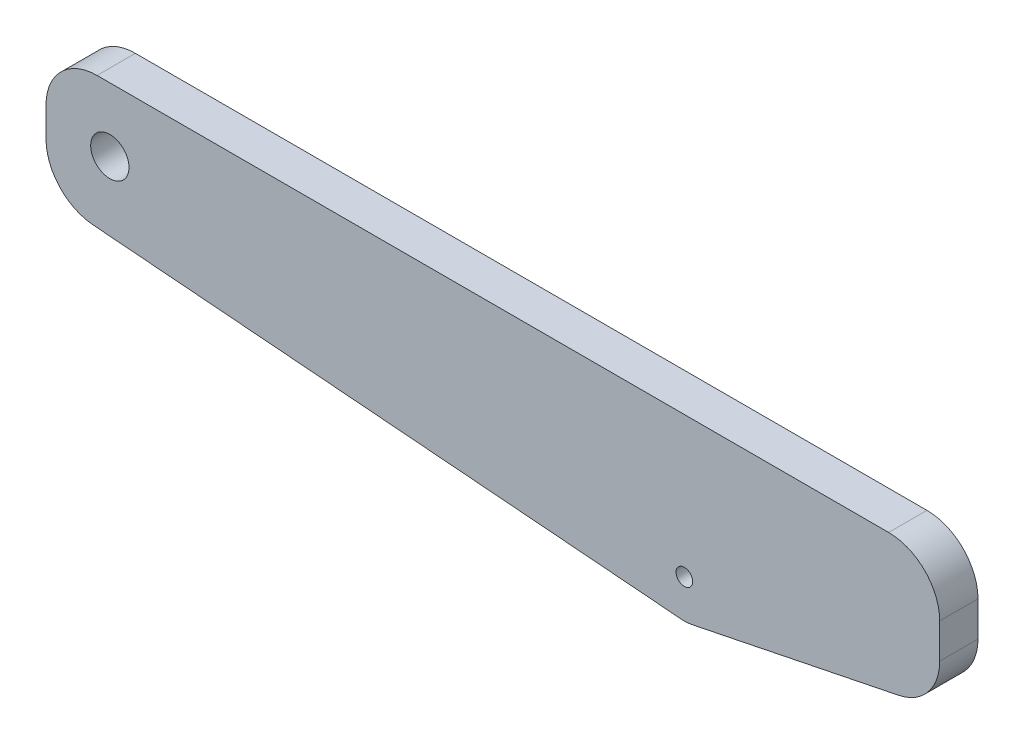
ISO-10303-21;
HEADER;
FILE_DESCRIPTION(('STEP AP214'),'2;1');
FILE_NAME('part.step','',(''),(''),'','','');
FILE_SCHEMA(('AUTOMOTIVE_DESIGN { 1 0 10303 214 1 1 1 1 }'));
ENDSEC;
DATA;
#1=APPLICATION_CONTEXT('core data for automotive mechanical design processes');
#2=APPLICATION_PROTOCOL_DEFINITION('international standard','automotive_design',2000,#1);
#3=PRODUCT_CONTEXT('',#1,'mechanical');
#4=PRODUCT('Part','Part','',(#3));
#5=PRODUCT_RELATED_PRODUCT_CATEGORY('part','',(#4));
#6=PRODUCT_DEFINITION_FORMATION('','',#4);
#7=PRODUCT_DEFINITION_CONTEXT('part definition',#1,'design');
#8=PRODUCT_DEFINITION('design','',#6,#7);
#9=PRODUCT_DEFINITION_SHAPE('','',#8);
#10=(LENGTH_UNIT() NAMED_UNIT(*) SI_UNIT(.MILLI.,.METRE.));
#11=(NAMED_UNIT(*) PLANE_ANGLE_UNIT() SI_UNIT($,.RADIAN.));
#12=(NAMED_UNIT(*) SI_UNIT($,.STERADIAN.) SOLID_ANGLE_UNIT());
#13=UNCERTAINTY_MEASURE_WITH_UNIT(LENGTH_MEASURE(1.E-05),#10,'distance_accuracy_value','');
#14=(GEOMETRIC_REPRESENTATION_CONTEXT(3) GLOBAL_UNCERTAINTY_ASSIGNED_CONTEXT((#13)) GLOBAL_UNIT_ASSIGNED_CONTEXT((#10,
#11,#12)) REPRESENTATION_CONTEXT('',''));
#15=CARTESIAN_POINT('',(0.,0.,0.));
#16=DIRECTION('',(0.,0.,1.));
#17=DIRECTION('',(1.,0.,0.));
#18=AXIS2_PLACEMENT_3D('',#15,#16,#17);
#19=CARTESIAN_POINT('',(330.,16.3352715419924,15.));
#20=DIRECTION('',(0.,0.,-1.));
#21=DIRECTION('',(-1.,0.,0.));
#22=AXIS2_PLACEMENT_3D('',#19,#20,#21);
#23=CYLINDRICAL_SURFACE('',#22,20.);
#24=DIRECTION('',(0.,0.,-1.));
#25=VECTOR('',#24,1.);
#26=CARTESIAN_POINT('',(350.,16.3352715419924,15.));
#27=LINE('',#26,#25);
#28=CARTESIAN_POINT('',(350.,16.3352715419924,15.));
#29=VERTEX_POINT('',#28);
#30=CARTESIAN_POINT('',(350.,16.3352715419924,0.));
#31=VERTEX_POINT('',#30);
#32=EDGE_CURVE('E169',#29,#31,#27,.T.);
#33=ORIENTED_EDGE('',*,*,#32,.F.);
#34=CARTESIAN_POINT('',(330.,16.3352715419924,15.));
#35=DIRECTION('',(0.,0.,1.));
#36=DIRECTION('',(1.,0.,0.));
#37=AXIS2_PLACEMENT_3D('',#34,#35,#36);
#38=CIRCLE('',#37,20.);
#39=CARTESIAN_POINT('',(333.993766222083,-3.26191783208227,15.));
#40=VERTEX_POINT('',#39);
#41=EDGE_CURVE('E40',#40,#29,#38,.T.);
#42=ORIENTED_EDGE('',*,*,#41,.F.);
#43=DIRECTION('',(0.,0.,-1.));
#44=VECTOR('',#43,1.);
#45=CARTESIAN_POINT('',(333.993766222083,-3.26191783208228,15.));
#46=LINE('',#45,#44);
#47=CARTESIAN_POINT('',(333.993766222083,-3.26191783208227,0.));
#48=VERTEX_POINT('',#47);
#49=EDGE_CURVE('E172',#48,#40,#46,.F.);
#50=ORIENTED_EDGE('',*,*,#49,.F.);
#51=CARTESIAN_POINT('',(330.,16.3352715419924,0.));
#52=DIRECTION('',(0.,0.,1.));
#53=DIRECTION('',(1.,0.,0.));
#54=AXIS2_PLACEMENT_3D('',#51,#52,#53);
#55=CIRCLE('',#54,20.);
#56=EDGE_CURVE('E11',#31,#48,#55,.F.);
#57=ORIENTED_EDGE('',*,*,#56,.F.);
#58=EDGE_LOOP('',(#33,#42,#50,#57));
#59=FACE_BOUND('',#58,.T.);
#60=ADVANCED_FACE('F33',(#59),#23,.T.);
#61=CARTESIAN_POINT('',(330.,30.,15.));
#62=DIRECTION('',(0.,0.,-1.));
#63=DIRECTION('',(-1.,0.,0.));
#64=AXIS2_PLACEMENT_3D('',#61,#62,#63);
#65=CYLINDRICAL_SURFACE('',#64,20.);
#66=DIRECTION('',(0.,0.,-1.));
#67=VECTOR('',#66,1.);
#68=CARTESIAN_POINT('',(330.,50.,15.));
#69=LINE('',#68,#67);
#70=CARTESIAN_POINT('',(330.,50.,15.));
#71=VERTEX_POINT('',#70);
#72=CARTESIAN_POINT('',(330.,50.,0.));
#73=VERTEX_POINT('',#72);
#74=EDGE_CURVE('E158',#71,#73,#69,.T.);
#75=ORIENTED_EDGE('',*,*,#74,.F.);
#76=CARTESIAN_POINT('',(330.,30.,15.));
#77=DIRECTION('',(0.,0.,1.));
#78=DIRECTION('',(1.,0.,0.));
#79=AXIS2_PLACEMENT_3D('',#76,#77,#78);
#80=CIRCLE('',#79,20.);
#81=CARTESIAN_POINT('',(350.,30.,15.));
#82=VERTEX_POINT('',#81);
#83=EDGE_CURVE('E164',#82,#71,#80,.T.);
#84=ORIENTED_EDGE('',*,*,#83,.F.);
#85=DIRECTION('',(0.,0.,-1.));
#86=VECTOR('',#85,1.);
#87=CARTESIAN_POINT('',(350.,30.,15.));
#88=LINE('',#87,#86);
#89=CARTESIAN_POINT('',(350.,30.,0.));
#90=VERTEX_POINT('',#89);
#91=EDGE_CURVE('E161',#90,#82,#88,.F.);
#92=ORIENTED_EDGE('',*,*,#91,.F.);
#93=CARTESIAN_POINT('',(330.,30.,0.));
#94=DIRECTION('',(0.,0.,1.));
#95=DIRECTION('',(1.,0.,0.));
#96=AXIS2_PLACEMENT_3D('',#93,#94,#95);
#97=CIRCLE('',#96,20.);
#98=EDGE_CURVE('E166',#73,#90,#97,.F.);
#99=ORIENTED_EDGE('',*,*,#98,.F.);
#100=EDGE_LOOP('',(#75,#84,#92,#99));
#101=FACE_BOUND('',#100,.T.);
#102=ADVANCED_FACE('F210',(#101),#65,.T.);
#103=CARTESIAN_POINT('',(20.,18.4551082880864,15.));
#104=DIRECTION('',(0.,0.,1.));
#105=DIRECTION('',(1.,0.,0.));
#106=AXIS2_PLACEMENT_3D('',#103,#104,#105);
#107=CYLINDRICAL_SURFACE('',#106,20.);
#108=DIRECTION('',(0.,0.,1.));
#109=VECTOR('',#108,1.);
#110=CARTESIAN_POINT('',(0.,18.4551082880864,15.));
#111=LINE('',#110,#109);
#112=CARTESIAN_POINT('',(0.,18.4551082880864,0.));
#113=VERTEX_POINT('',#112);
#114=CARTESIAN_POINT('',(0.,18.4551082880864,15.));
#115=VERTEX_POINT('',#114);
#116=EDGE_CURVE('E150',#113,#115,#111,.T.);
#117=ORIENTED_EDGE('',*,*,#116,.F.);
#118=CARTESIAN_POINT('',(20.,18.4551082880864,0.));
#119=DIRECTION('',(0.,0.,1.));
#120=DIRECTION('',(1.,0.,0.));
#121=AXIS2_PLACEMENT_3D('',#118,#119,#120);
#122=CIRCLE('',#121,20.);
#123=CARTESIAN_POINT('',(18.3956333167371,-1.48043804367077,0.));
#124=VERTEX_POINT('',#123);
#125=EDGE_CURVE('E155',#124,#113,#122,.F.);
#126=ORIENTED_EDGE('',*,*,#125,.F.);
#127=DIRECTION('',(0.,0.,1.));
#128=VECTOR('',#127,1.);
#129=CARTESIAN_POINT('',(18.3956333167371,-1.48043804367077,15.));
#130=LINE('',#129,#128);
#131=CARTESIAN_POINT('',(18.3956333167371,-1.48043804367077,15.));
#132=VERTEX_POINT('',#131);
#133=EDGE_CURVE('E153',#132,#124,#130,.F.);
#134=ORIENTED_EDGE('',*,*,#133,.F.);
#135=CARTESIAN_POINT('',(20.,18.4551082880864,15.));
#136=DIRECTION('',(0.,0.,1.));
#137=DIRECTION('',(1.,0.,0.));
#138=AXIS2_PLACEMENT_3D('',#135,#136,#137);
#139=CIRCLE('',#138,20.);
#140=EDGE_CURVE('E114',#115,#132,#139,.T.);
#141=ORIENTED_EDGE('',*,*,#140,.F.);
#142=EDGE_LOOP('',(#117,#126,#134,#141));
#143=FACE_BOUND('',#142,.T.);
#144=ADVANCED_FACE('F207',(#143),#107,.T.);
#145=CARTESIAN_POINT('',(20.,30.,15.));
#146=DIRECTION('',(0.,0.,1.));
#147=DIRECTION('',(1.,0.,0.));
#148=AXIS2_PLACEMENT_3D('',#145,#146,#147);
#149=CYLINDRICAL_SURFACE('',#148,20.);
#150=DIRECTION('',(0.,0.,1.));
#151=VECTOR('',#150,1.);
#152=CARTESIAN_POINT('',(20.,50.,15.));
#153=LINE('',#152,#151);
#154=CARTESIAN_POINT('',(20.,50.,0.));
#155=VERTEX_POINT('',#154);
#156=CARTESIAN_POINT('',(20.,50.,15.));
#157=VERTEX_POINT('',#156);
#158=EDGE_CURVE('E134',#155,#157,#153,.T.);
#159=ORIENTED_EDGE('',*,*,#158,.F.);
#160=CARTESIAN_POINT('',(20.,30.,0.));
#161=DIRECTION('',(0.,0.,1.));
#162=DIRECTION('',(1.,0.,0.));
#163=AXIS2_PLACEMENT_3D('',#160,#161,#162);
#164=CIRCLE('',#163,20.);
#165=CARTESIAN_POINT('',(0.,30.,0.));
#166=VERTEX_POINT('',#165);
#167=EDGE_CURVE('E145',#166,#155,#164,.F.);
#168=ORIENTED_EDGE('',*,*,#167,.F.);
#169=DIRECTION('',(0.,0.,1.));
#170=VECTOR('',#169,1.);
#171=CARTESIAN_POINT('',(0.,30.,15.));
#172=LINE('',#171,#170);
#173=CARTESIAN_POINT('',(0.,30.,15.));
#174=VERTEX_POINT('',#173);
#175=EDGE_CURVE('E137',#174,#166,#172,.F.);
#176=ORIENTED_EDGE('',*,*,#175,.F.);
#177=CARTESIAN_POINT('',(20.,30.,15.));
#178=DIRECTION('',(0.,0.,1.));
#179=DIRECTION('',(1.,0.,0.));
#180=AXIS2_PLACEMENT_3D('',#177,#178,#179);
#181=CIRCLE('',#180,20.);
#182=EDGE_CURVE('E148',#157,#174,#181,.T.);
#183=ORIENTED_EDGE('',*,*,#182,.F.);
#184=EDGE_LOOP('',(#159,#168,#176,#183));
#185=FACE_BOUND('',#184,.T.);
#186=ADVANCED_FACE('F209',(#185),#149,.T.);
#187=CARTESIAN_POINT('',(250.,-5.0709255283711,15.));
#188=DIRECTION('',(0.,0.,1.));
#189=DIRECTION('',(1.,0.,0.));
#190=AXIS2_PLACEMENT_3D('',#187,#188,#189);
#191=PLANE('',#190);
#192=CARTESIAN_POINT('',(25.,25.,15.));
#193=DIRECTION('',(0.,0.,1.));
#194=DIRECTION('',(1.,0.,0.));
#195=AXIS2_PLACEMENT_3D('',#192,#193,#194);
#196=CIRCLE('',#195,7.5);
#197=CARTESIAN_POINT('',(32.5,25.,15.));
#198=VERTEX_POINT('',#197);
#199=EDGE_CURVE('E187',#198,#198,#196,.T.);
#200=ORIENTED_EDGE('',*,*,#199,.F.);
#201=EDGE_LOOP('',(#200));
#202=FACE_BOUND('',#201,.T.);
#203=DIRECTION('',(0.979859468703734,0.199688311104173,0.));
#204=VECTOR('',#203,1.);
#205=CARTESIAN_POINT('',(350.,3.74710379536433E-05,15.));
#206=LINE('',#205,#204);
#207=CARTESIAN_POINT('',(252.995324666563,-19.7688175589271,15.));
#208=VERTEX_POINT('',#207);
#209=EDGE_CURVE('E128',#208,#40,#206,.T.);
#210=ORIENTED_EDGE('',*,*,#209,.T.);
#211=ORIENTED_EDGE('',*,*,#41,.T.);
#212=DIRECTION('',(0.,1.,0.));
#213=VECTOR('',#212,1.);
#214=CARTESIAN_POINT('',(350.,3.74710379536433E-05,15.));
#215=LINE('',#214,#213);
#216=EDGE_CURVE('E174',#29,#82,#215,.T.);
#217=ORIENTED_EDGE('',*,*,#216,.T.);
#218=ORIENTED_EDGE('',*,*,#83,.T.);
#219=DIRECTION('',(-1.,0.,0.));
#220=VECTOR('',#219,1.);
#221=CARTESIAN_POINT('',(105.,50.,15.));
#222=LINE('',#221,#220);
#223=EDGE_CURVE('E179',#71,#157,#222,.T.);
#224=ORIENTED_EDGE('',*,*,#223,.T.);
#225=ORIENTED_EDGE('',*,*,#182,.T.);
#226=DIRECTION('',(0.,-1.,0.));
#227=VECTOR('',#226,1.);
#228=CARTESIAN_POINT('',(0.,0.,15.));
#229=LINE('',#228,#227);
#230=EDGE_CURVE('E139',#174,#115,#229,.T.);
#231=ORIENTED_EDGE('',*,*,#230,.T.);
#232=ORIENTED_EDGE('',*,*,#140,.T.);
#233=DIRECTION('',(0.996777316587857,-0.0802183341631464,0.));
#234=VECTOR('',#233,1.);
#235=CARTESIAN_POINT('',(0.,0.,15.));
#236=LINE('',#235,#234);
#237=CARTESIAN_POINT('',(248.796724987553,-20.022585277189,15.));
#238=VERTEX_POINT('',#237);
#239=EDGE_CURVE('E106',#132,#238,#236,.T.);
#240=ORIENTED_EDGE('',*,*,#239,.T.);
#241=CARTESIAN_POINT('',(250.,-5.0709255283711,15.));
#242=DIRECTION('',(0.,0.,1.));
#243=DIRECTION('',(1.,0.,0.));
#244=AXIS2_PLACEMENT_3D('',#241,#242,#243);
#245=CIRCLE('',#244,15.);
#246=EDGE_CURVE('E111',#238,#208,#245,.T.);
#247=ORIENTED_EDGE('',*,*,#246,.T.);
#248=EDGE_LOOP('',(#210,#211,#217,#218,#224,#225,#231,#232,#240,#247));
#249=FACE_BOUND('',#248,.T.);
#250=CARTESIAN_POINT('',(250.,-5.0709255283711,15.));
#251=DIRECTION('',(0.,0.,1.));
#252=DIRECTION('',(1.,0.,0.));
#253=AXIS2_PLACEMENT_3D('',#250,#251,#252);
#254=CIRCLE('',#253,3.25000000000001);
#255=CARTESIAN_POINT('',(253.25,-5.0709255283711,15.));
#256=VERTEX_POINT('',#255);
#257=EDGE_CURVE('E325',#256,#256,#254,.T.);
#258=ORIENTED_EDGE('',*,*,#257,.F.);
#259=EDGE_LOOP('',(#258));
#260=FACE_BOUND('',#259,.T.);
#261=ADVANCED_FACE('F109',(#202,#249,#260),#191,.T.);
#262=CARTESIAN_POINT('',(250.,-5.0709255283711,0.));
#263=DIRECTION('',(0.,0.,1.));
#264=DIRECTION('',(1.,0.,0.));
#265=AXIS2_PLACEMENT_3D('',#262,#263,#264);
#266=PLANE('',#265);
#267=DIRECTION('',(0.,1.,0.));
#268=VECTOR('',#267,1.);
#269=CARTESIAN_POINT('',(350.,3.74710379536433E-05,0.));
#270=LINE('',#269,#268);
#271=EDGE_CURVE('E192',#31,#90,#270,.T.);
#272=ORIENTED_EDGE('',*,*,#271,.F.);
#273=ORIENTED_EDGE('',*,*,#56,.T.);
#274=DIRECTION('',(0.979859468703734,0.199688311104173,0.));
#275=VECTOR('',#274,1.);
#276=CARTESIAN_POINT('',(350.,3.74710379536433E-05,0.));
#277=LINE('',#276,#275);
#278=CARTESIAN_POINT('',(252.995324666563,-19.7688175589271,0.));
#279=VERTEX_POINT('',#278);
#280=EDGE_CURVE('E189',#279,#48,#277,.T.);
#281=ORIENTED_EDGE('',*,*,#280,.F.);
#282=CARTESIAN_POINT('',(250.,-5.0709255283711,0.));
#283=DIRECTION('',(0.,0.,1.));
#284=DIRECTION('',(1.,0.,0.));
#285=AXIS2_PLACEMENT_3D('',#282,#283,#284);
#286=CIRCLE('',#285,15.);
#287=CARTESIAN_POINT('',(248.796724987553,-20.022585277189,0.));
#288=VERTEX_POINT('',#287);
#289=EDGE_CURVE('E186',#288,#279,#286,.T.);
#290=ORIENTED_EDGE('',*,*,#289,.F.);
#291=DIRECTION('',(0.996777316587857,-0.0802183341631464,0.));
#292=VECTOR('',#291,1.);
#293=CARTESIAN_POINT('',(0.,0.,0.));
#294=LINE('',#293,#292);
#295=EDGE_CURVE('E132',#124,#288,#294,.T.);
#296=ORIENTED_EDGE('',*,*,#295,.F.);
#297=ORIENTED_EDGE('',*,*,#125,.T.);
#298=DIRECTION('',(0.,-1.,0.));
#299=VECTOR('',#298,1.);
#300=CARTESIAN_POINT('',(0.,0.,0.));
#301=LINE('',#300,#299);
#302=EDGE_CURVE('E119',#166,#113,#301,.T.);
#303=ORIENTED_EDGE('',*,*,#302,.F.);
#304=ORIENTED_EDGE('',*,*,#167,.T.);
#305=DIRECTION('',(-1.,0.,0.));
#306=VECTOR('',#305,1.);
#307=CARTESIAN_POINT('',(0.,50.,0.));
#308=LINE('',#307,#306);
#309=EDGE_CURVE('E194',#73,#155,#308,.T.);
#310=ORIENTED_EDGE('',*,*,#309,.F.);
#311=ORIENTED_EDGE('',*,*,#98,.T.);
#312=EDGE_LOOP('',(#272,#273,#281,#290,#296,#297,#303,#304,#310,#311));
#313=FACE_BOUND('',#312,.T.);
#314=CARTESIAN_POINT('',(25.,25.,0.));
#315=DIRECTION('',(0.,0.,1.));
#316=DIRECTION('',(1.,0.,0.));
#317=AXIS2_PLACEMENT_3D('',#314,#315,#316);
#318=CIRCLE('',#317,7.5);
#319=CARTESIAN_POINT('',(32.5,25.,0.));
#320=VERTEX_POINT('',#319);
#321=EDGE_CURVE('E322',#320,#320,#318,.T.);
#322=ORIENTED_EDGE('',*,*,#321,.T.);
#323=EDGE_LOOP('',(#322));
#324=FACE_BOUND('',#323,.T.);
#325=CARTESIAN_POINT('',(250.,-5.0709255283711,0.));
#326=DIRECTION('',(0.,0.,1.));
#327=DIRECTION('',(1.,0.,0.));
#328=AXIS2_PLACEMENT_3D('',#325,#326,#327);
#329=CIRCLE('',#328,3.25000000000001);
#330=CARTESIAN_POINT('',(253.25,-5.0709255283711,0.));
#331=VERTEX_POINT('',#330);
#332=EDGE_CURVE('E328',#331,#331,#329,.T.);
#333=ORIENTED_EDGE('',*,*,#332,.T.);
#334=EDGE_LOOP('',(#333));
#335=FACE_BOUND('',#334,.T.);
#336=ADVANCED_FACE('F202',(#313,#324,#335),#266,.F.);
#337=CARTESIAN_POINT('',(0.,0.,15.));
#338=DIRECTION('',(0.0802183341631464,0.996777316587858,0.));
#339=DIRECTION('',(-0.996777316587858,0.0802183341631464,0.));
#340=AXIS2_PLACEMENT_3D('',#337,#338,#339);
#341=PLANE('',#340);
#342=ORIENTED_EDGE('',*,*,#239,.F.);
#343=ORIENTED_EDGE('',*,*,#133,.T.);
#344=ORIENTED_EDGE('',*,*,#295,.T.);
#345=DIRECTION('',(0.,0.,-1.));
#346=VECTOR('',#345,1.);
#347=CARTESIAN_POINT('',(248.796724987553,-20.022585277189,15.));
#348=LINE('',#347,#346);
#349=EDGE_CURVE('E124',#238,#288,#348,.T.);
#350=ORIENTED_EDGE('',*,*,#349,.F.);
#351=EDGE_LOOP('',(#342,#343,#344,#350));
#352=FACE_BOUND('',#351,.T.);
#353=ADVANCED_FACE('F130',(#352),#341,.F.);
#354=CARTESIAN_POINT('',(250.,-5.0709255283711,15.));
#355=DIRECTION('',(0.,0.,-1.));
#356=DIRECTION('',(-1.,0.,0.));
#357=AXIS2_PLACEMENT_3D('',#354,#355,#356);
#358=CYLINDRICAL_SURFACE('',#357,15.);
#359=ORIENTED_EDGE('',*,*,#289,.T.);
#360=DIRECTION('',(0.,0.,-1.));
#361=VECTOR('',#360,1.);
#362=CARTESIAN_POINT('',(252.995324666563,-19.7688175589271,15.));
#363=LINE('',#362,#361);
#364=EDGE_CURVE('E126',#208,#279,#363,.T.);
#365=ORIENTED_EDGE('',*,*,#364,.F.);
#366=ORIENTED_EDGE('',*,*,#246,.F.);
#367=ORIENTED_EDGE('',*,*,#349,.T.);
#368=EDGE_LOOP('',(#359,#365,#366,#367));
#369=FACE_BOUND('',#368,.T.);
#370=ADVANCED_FACE('F123',(#369),#358,.T.);
#371=CARTESIAN_POINT('',(350.,3.74710379536433E-05,15.));
#372=DIRECTION('',(-0.199688311104173,0.979859468703734,0.));
#373=DIRECTION('',(-0.979859468703734,-0.199688311104173,0.));
#374=AXIS2_PLACEMENT_3D('',#371,#372,#373);
#375=PLANE('',#374);
#376=ORIENTED_EDGE('',*,*,#280,.T.);
#377=ORIENTED_EDGE('',*,*,#49,.T.);
#378=ORIENTED_EDGE('',*,*,#209,.F.);
#379=ORIENTED_EDGE('',*,*,#364,.T.);
#380=EDGE_LOOP('',(#376,#377,#378,#379));
#381=FACE_BOUND('',#380,.T.);
#382=ADVANCED_FACE('F303',(#381),#375,.F.);
#383=CARTESIAN_POINT('',(350.,3.74710379536433E-05,15.));
#384=DIRECTION('',(-1.,0.,0.));
#385=DIRECTION('',(0.,0.,1.));
#386=AXIS2_PLACEMENT_3D('',#383,#384,#385);
#387=PLANE('',#386);
#388=ORIENTED_EDGE('',*,*,#216,.F.);
#389=ORIENTED_EDGE('',*,*,#32,.T.);
#390=ORIENTED_EDGE('',*,*,#271,.T.);
#391=ORIENTED_EDGE('',*,*,#91,.T.);
#392=EDGE_LOOP('',(#388,#389,#390,#391));
#393=FACE_BOUND('',#392,.T.);
#394=ADVANCED_FACE('F177',(#393),#387,.F.);
#395=CARTESIAN_POINT('',(0.,50.,15.));
#396=DIRECTION('',(0.,-1.,0.));
#397=DIRECTION('',(0.,0.,-1.));
#398=AXIS2_PLACEMENT_3D('',#395,#396,#397);
#399=PLANE('',#398);
#400=ORIENTED_EDGE('',*,*,#223,.F.);
#401=ORIENTED_EDGE('',*,*,#74,.T.);
#402=ORIENTED_EDGE('',*,*,#309,.T.);
#403=ORIENTED_EDGE('',*,*,#158,.T.);
#404=EDGE_LOOP('',(#400,#401,#402,#403));
#405=FACE_BOUND('',#404,.T.);
#406=ADVANCED_FACE('F242',(#405),#399,.F.);
#407=CARTESIAN_POINT('',(0.,0.,15.));
#408=DIRECTION('',(1.,0.,0.));
#409=DIRECTION('',(0.,0.,-1.));
#410=AXIS2_PLACEMENT_3D('',#407,#408,#409);
#411=PLANE('',#410);
#412=ORIENTED_EDGE('',*,*,#302,.T.);
#413=ORIENTED_EDGE('',*,*,#116,.T.);
#414=ORIENTED_EDGE('',*,*,#230,.F.);
#415=ORIENTED_EDGE('',*,*,#175,.T.);
#416=EDGE_LOOP('',(#412,#413,#414,#415));
#417=FACE_BOUND('',#416,.T.);
#418=ADVANCED_FACE('F198',(#417),#411,.F.);
#419=CARTESIAN_POINT('',(25.,25.,15.));
#420=DIRECTION('',(0.,0.,-1.));
#421=DIRECTION('',(-1.,0.,0.));
#422=AXIS2_PLACEMENT_3D('',#419,#420,#421);
#423=CYLINDRICAL_SURFACE('',#422,7.5);
#424=ORIENTED_EDGE('',*,*,#199,.T.);
#425=EDGE_LOOP('',(#424));
#426=FACE_BOUND('',#425,.T.);
#427=ORIENTED_EDGE('',*,*,#321,.F.);
#428=EDGE_LOOP('',(#427));
#429=FACE_BOUND('',#428,.T.);
#430=ADVANCED_FACE('F259',(#426,#429),#423,.F.);
#431=CARTESIAN_POINT('',(250.,-5.0709255283711,15.));
#432=DIRECTION('',(0.,0.,-1.));
#433=DIRECTION('',(-1.,0.,0.));
#434=AXIS2_PLACEMENT_3D('',#431,#432,#433);
#435=CYLINDRICAL_SURFACE('',#434,3.25000000000001);
#436=ORIENTED_EDGE('',*,*,#257,.T.);
#437=EDGE_LOOP('',(#436));
#438=FACE_BOUND('',#437,.T.);
#439=ORIENTED_EDGE('',*,*,#332,.F.);
#440=EDGE_LOOP('',(#439));
#441=FACE_BOUND('',#440,.T.);
#442=ADVANCED_FACE('F227',(#438,#441),#435,.F.);
#443=CLOSED_SHELL('',(#60,#102,#144,#186,#261,#336,#353,#370,#382,#394,#406,#418,#430,#442));
#444=MANIFOLD_SOLID_BREP('B2',#443);
#445=ADVANCED_BREP_SHAPE_REPRESENTATION('',(#18,#444),#14);
#446=SHAPE_DEFINITION_REPRESENTATION(#9,#445);
ENDSEC;
END-ISO-10303-21;
